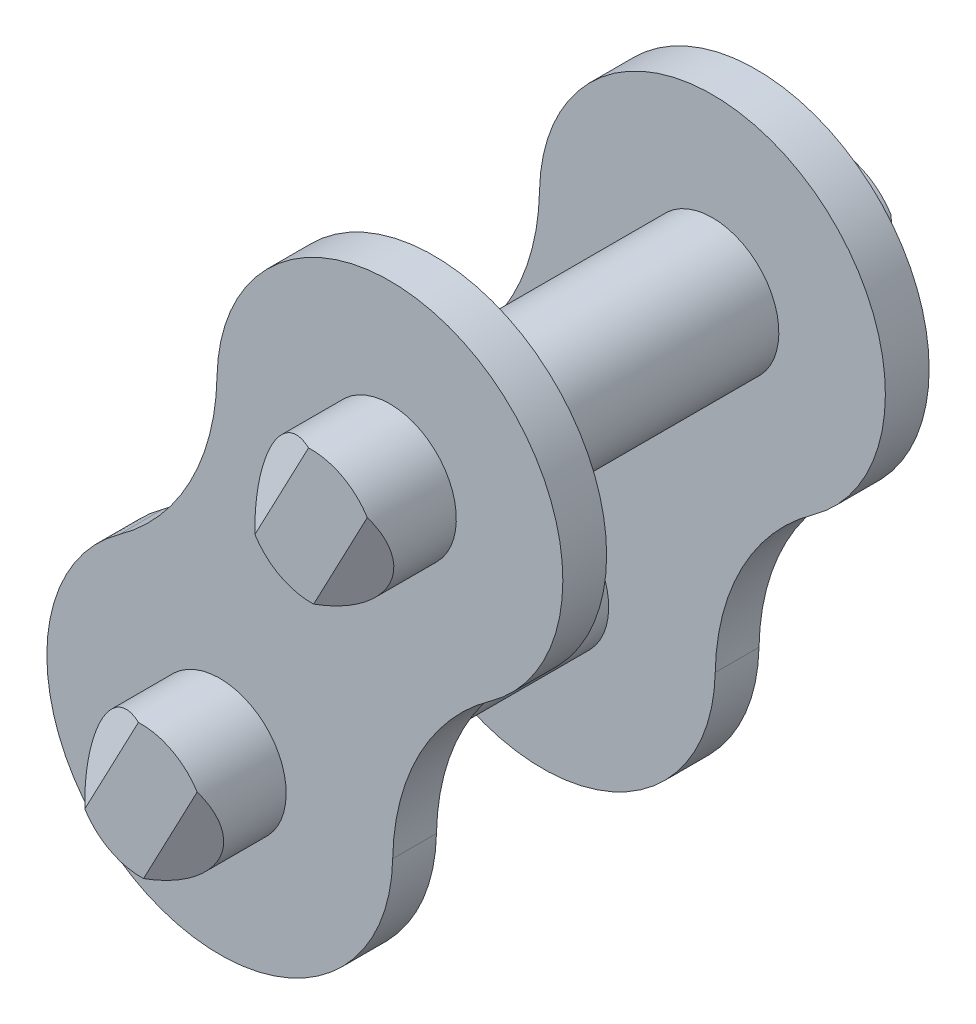
ISO-10303-21;
HEADER;
FILE_DESCRIPTION(('STEP AP214'),'2;1');
FILE_NAME('part.step','',(''),(''),'','','');
FILE_SCHEMA(('AUTOMOTIVE_DESIGN { 1 0 10303 214 1 1 1 1 }'));
ENDSEC;
DATA;
#1=APPLICATION_CONTEXT('core data for automotive mechanical design processes');
#2=APPLICATION_PROTOCOL_DEFINITION('international standard','automotive_design',2000,#1);
#3=PRODUCT_CONTEXT('',#1,'mechanical');
#4=PRODUCT('Part','Part','',(#3));
#5=PRODUCT_RELATED_PRODUCT_CATEGORY('part','',(#4));
#6=PRODUCT_DEFINITION_FORMATION('','',#4);
#7=PRODUCT_DEFINITION_CONTEXT('part definition',#1,'design');
#8=PRODUCT_DEFINITION('design','',#6,#7);
#9=PRODUCT_DEFINITION_SHAPE('','',#8);
#10=(LENGTH_UNIT() NAMED_UNIT(*) SI_UNIT(.MILLI.,.METRE.));
#11=(NAMED_UNIT(*) PLANE_ANGLE_UNIT() SI_UNIT($,.RADIAN.));
#12=(NAMED_UNIT(*) SI_UNIT($,.STERADIAN.) SOLID_ANGLE_UNIT());
#13=UNCERTAINTY_MEASURE_WITH_UNIT(LENGTH_MEASURE(1.E-05),#10,'distance_accuracy_value','');
#14=(GEOMETRIC_REPRESENTATION_CONTEXT(3) GLOBAL_UNCERTAINTY_ASSIGNED_CONTEXT((#13)) GLOBAL_UNIT_ASSIGNED_CONTEXT((#10,
#11,#12)) REPRESENTATION_CONTEXT('',''));
#15=CARTESIAN_POINT('',(0.,0.,0.));
#16=DIRECTION('',(0.,0.,1.));
#17=DIRECTION('',(1.,0.,0.));
#18=AXIS2_PLACEMENT_3D('',#15,#16,#17);
#19=CARTESIAN_POINT('',(76.8623646693601,898.104394287138,-131.392489073474));
#20=DIRECTION('',(0.442314989611032,-0.233146842066093,0.866025403784439));
#21=DIRECTION('',(-0.466293684132187,-0.884629979222066,0.));
#22=AXIS2_PLACEMENT_3D('',#19,#20,#21);
#23=PLANE('',#22);
#24=CARTESIAN_POINT('',(84.3916380449218,910.529709377054,-131.892921853051));
#25=DIRECTION('',(-0.442314989611033,0.233146842066093,-0.866025403784439));
#26=DIRECTION('',(-0.766112034955609,0.403822176082711,0.5));
#27=AXIS2_PLACEMENT_3D('',#24,#25,#26);
#28=ELLIPSE('',#27,1.3344874122049,1.1557);
#29=CARTESIAN_POINT('',(83.4137573225295,909.913761503631,-131.5593));
#30=VERTEX_POINT('',#29);
#31=CARTESIAN_POINT('',(84.3471519003271,911.684552861228,-131.5593));
#32=VERTEX_POINT('',#31);
#33=EDGE_CURVE('E210',#30,#32,#28,.T.);
#34=ORIENTED_EDGE('',*,*,#33,.T.);
#35=DIRECTION('',(0.466293684132187,0.884629979222065,0.));
#36=VECTOR('',#35,1.);
#37=CARTESIAN_POINT('',(77.1179563861069,897.96967038445,-131.5593));
#38=LINE('',#37,#36);
#39=EDGE_CURVE('E268',#30,#32,#38,.T.);
#40=ORIENTED_EDGE('',*,*,#39,.F.);
#41=EDGE_LOOP('',(#34,#40));
#42=FACE_BOUND('',#41,.T.);
#43=ADVANCED_FACE('F17',(#42),#23,.F.);
#44=CARTESIAN_POINT('',(78.3959149698406,897.29605087101,-131.392489073474));
#45=DIRECTION('',(0.442314989611033,-0.233146842066094,-0.866025403784438));
#46=DIRECTION('',(0.,-0.96561963328113,0.259959081053184));
#47=AXIS2_PLACEMENT_3D('',#44,#45,#46);
#48=PLANE('',#47);
#49=CARTESIAN_POINT('',(84.3916380449218,910.529709377054,-131.892921853051));
#50=DIRECTION('',(-0.442314989611033,0.233146842066094,0.866025403784439));
#51=DIRECTION('',(0.766112034955609,-0.403822176082711,0.5));
#52=AXIS2_PLACEMENT_3D('',#49,#50,#51);
#53=ELLIPSE('',#52,1.3344874122049,1.1557);
#54=CARTESIAN_POINT('',(84.4361241895165,909.37486589288,-131.5593));
#55=VERTEX_POINT('',#54);
#56=CARTESIAN_POINT('',(85.3695187673141,911.145657250476,-131.5593));
#57=VERTEX_POINT('',#56);
#58=EDGE_CURVE('E165',#55,#57,#53,.T.);
#59=ORIENTED_EDGE('',*,*,#58,.F.);
#60=DIRECTION('',(0.466293684132187,0.884629979222065,0.));
#61=VECTOR('',#60,1.);
#62=CARTESIAN_POINT('',(78.1403232530938,897.430774773698,-131.5593));
#63=LINE('',#62,#61);
#64=EDGE_CURVE('E269',#55,#57,#63,.T.);
#65=ORIENTED_EDGE('',*,*,#64,.T.);
#66=EDGE_LOOP('',(#59,#65));
#67=FACE_BOUND('',#66,.T.);
#68=ADVANCED_FACE('F19',(#67),#48,.T.);
#69=CARTESIAN_POINT('',(76.8623646693601,898.104394287138,-131.392489073474));
#70=DIRECTION('',(0.442314989611032,-0.233146842066093,0.866025403784439));
#71=DIRECTION('',(-0.466293684132187,-0.884629979222066,0.));
#72=AXIS2_PLACEMENT_3D('',#69,#70,#71);
#73=PLANE('',#72);
#74=CARTESIAN_POINT('',(87.3526029391612,916.147109745114,-131.892921853051));
#75=DIRECTION('',(-0.442314989611033,0.233146842066093,-0.866025403784439));
#76=DIRECTION('',(-0.766112034955609,0.403822176082711,0.5));
#77=AXIS2_PLACEMENT_3D('',#74,#75,#76);
#78=ELLIPSE('',#77,1.3344874122049,1.1557);
#79=CARTESIAN_POINT('',(86.3747222167689,915.531161871692,-131.5593));
#80=VERTEX_POINT('',#79);
#81=CARTESIAN_POINT('',(87.3081167945665,917.301953229288,-131.5593));
#82=VERTEX_POINT('',#81);
#83=EDGE_CURVE('E275',#80,#82,#78,.T.);
#84=ORIENTED_EDGE('',*,*,#83,.T.);
#85=DIRECTION('',(0.466293684132187,0.884629979222065,0.));
#86=VECTOR('',#85,1.);
#87=CARTESIAN_POINT('',(77.1179563861069,897.96967038445,-131.5593));
#88=LINE('',#87,#86);
#89=EDGE_CURVE('E238',#80,#82,#88,.T.);
#90=ORIENTED_EDGE('',*,*,#89,.F.);
#91=EDGE_LOOP('',(#84,#90));
#92=FACE_BOUND('',#91,.T.);
#93=ADVANCED_FACE('F424',(#92),#73,.F.);
#94=CARTESIAN_POINT('',(78.3959149698406,897.29605087101,-131.392489073474));
#95=DIRECTION('',(0.442314989611033,-0.233146842066094,-0.866025403784438));
#96=DIRECTION('',(0.,-0.96561963328113,0.259959081053184));
#97=AXIS2_PLACEMENT_3D('',#94,#95,#96);
#98=PLANE('',#97);
#99=CARTESIAN_POINT('',(87.3526029391612,916.147109745114,-131.892921853051));
#100=DIRECTION('',(-0.442314989611033,0.233146842066094,0.866025403784439));
#101=DIRECTION('',(0.766112034955609,-0.403822176082711,0.5));
#102=AXIS2_PLACEMENT_3D('',#99,#100,#101);
#103=ELLIPSE('',#102,1.3344874122049,1.1557);
#104=CARTESIAN_POINT('',(87.3970890837559,914.99226626094,-131.5593));
#105=VERTEX_POINT('',#104);
#106=CARTESIAN_POINT('',(88.3304836615534,916.763057618536,-131.5593));
#107=VERTEX_POINT('',#106);
#108=EDGE_CURVE('E283',#105,#107,#103,.T.);
#109=ORIENTED_EDGE('',*,*,#108,.F.);
#110=DIRECTION('',(0.466293684132187,0.884629979222065,0.));
#111=VECTOR('',#110,1.);
#112=CARTESIAN_POINT('',(78.1403232530938,897.430774773698,-131.5593));
#113=LINE('',#112,#111);
#114=EDGE_CURVE('E234',#105,#107,#113,.T.);
#115=ORIENTED_EDGE('',*,*,#114,.T.);
#116=EDGE_LOOP('',(#109,#115));
#117=FACE_BOUND('',#116,.T.);
#118=ADVANCED_FACE('F415',(#117),#98,.T.);
#119=CARTESIAN_POINT('',(85.8721204920415,913.338409561084,-129.4257));
#120=DIRECTION('',(0.,0.,-1.));
#121=DIRECTION('',(0.,-1.,0.));
#122=AXIS2_PLACEMENT_3D('',#119,#120,#121);
#123=PLANE('',#122);
#124=CARTESIAN_POINT('',(84.3916380449218,910.529709377054,-129.4257));
#125=DIRECTION('',(0.,0.,1.));
#126=DIRECTION('',(0.466293684132187,0.884629979222065,0.));
#127=AXIS2_PLACEMENT_3D('',#124,#125,#126);
#128=CIRCLE('',#127,1.1557);
#129=CARTESIAN_POINT('',(84.9305336556734,911.552076244041,-129.4257));
#130=VERTEX_POINT('',#129);
#131=EDGE_CURVE('E183',#130,#130,#128,.T.);
#132=ORIENTED_EDGE('',*,*,#131,.F.);
#133=EDGE_LOOP('',(#132));
#134=FACE_BOUND('',#133,.T.);
#135=CARTESIAN_POINT('',(87.3526029391612,916.147109745114,-129.4257));
#136=DIRECTION('',(0.,0.,1.));
#137=DIRECTION('',(0.466293684132187,0.884629979222065,0.));
#138=AXIS2_PLACEMENT_3D('',#135,#136,#137);
#139=CIRCLE('',#138,1.1557);
#140=CARTESIAN_POINT('',(87.8914985499128,917.169476612101,-129.4257));
#141=VERTEX_POINT('',#140);
#142=EDGE_CURVE('E188',#141,#141,#139,.T.);
#143=ORIENTED_EDGE('',*,*,#142,.F.);
#144=EDGE_LOOP('',(#143));
#145=FACE_BOUND('',#144,.T.);
#146=CARTESIAN_POINT('',(91.4648173346434,910.390466040942,-129.4257));
#147=DIRECTION('',(0.,0.,1.));
#148=DIRECTION('',(0.466293684132187,0.884629979222065,0.));
#149=AXIS2_PLACEMENT_3D('',#146,#147,#148);
#150=CIRCLE('',#149,4.06464973628698);
#151=CARTESIAN_POINT('',(89.1021636278755,913.697918979472,-129.4257));
#152=VERTEX_POINT('',#151);
#153=CARTESIAN_POINT('',(87.4009549820739,910.470467653837,-129.4257));
#154=VERTEX_POINT('',#153);
#155=EDGE_CURVE('E237',#152,#154,#150,.T.);
#156=ORIENTED_EDGE('',*,*,#155,.F.);
#157=CARTESIAN_POINT('',(87.3526029391612,916.147109745114,-129.4257));
#158=DIRECTION('',(0.,0.,1.));
#159=DIRECTION('',(0.466293684132187,0.884629979222065,0.));
#160=AXIS2_PLACEMENT_3D('',#157,#158,#159);
#161=CIRCLE('',#160,3.0099);
#162=CARTESIAN_POINT('',(84.3432860020091,916.206351468331,-129.4257));
#163=VERTEX_POINT('',#162);
#164=EDGE_CURVE('E131',#152,#163,#161,.T.);
#165=ORIENTED_EDGE('',*,*,#164,.T.);
#166=CARTESIAN_POINT('',(80.2794236494397,916.286353081226,-129.4257));
#167=DIRECTION('',(0.,0.,1.));
#168=DIRECTION('',(0.466293684132187,0.884629979222065,0.));
#169=AXIS2_PLACEMENT_3D('',#166,#167,#168);
#170=CIRCLE('',#169,4.06464973628691);
#171=CARTESIAN_POINT('',(82.6420773562075,912.978900142696,-129.4257));
#172=VERTEX_POINT('',#171);
#173=EDGE_CURVE('E116',#172,#163,#170,.T.);
#174=ORIENTED_EDGE('',*,*,#173,.F.);
#175=CARTESIAN_POINT('',(84.3916380449218,910.529709377054,-129.4257));
#176=DIRECTION('',(0.,0.,1.));
#177=DIRECTION('',(0.466293684132187,0.884629979222065,0.));
#178=AXIS2_PLACEMENT_3D('',#175,#176,#177);
#179=CIRCLE('',#178,3.0099);
#180=EDGE_CURVE('E21',#172,#154,#179,.T.);
#181=ORIENTED_EDGE('',*,*,#180,.T.);
#182=EDGE_LOOP('',(#156,#165,#174,#181));
#183=FACE_BOUND('',#182,.T.);
#184=ADVANCED_FACE('F309',(#134,#145,#183),#123,.F.);
#185=CARTESIAN_POINT('',(85.8721204920415,913.338409561084,-130.1877));
#186=DIRECTION('',(0.,0.,-1.));
#187=DIRECTION('',(0.,-1.,0.));
#188=AXIS2_PLACEMENT_3D('',#185,#186,#187);
#189=PLANE('',#188);
#190=CARTESIAN_POINT('',(84.3916380449218,910.529709377054,-130.1877));
#191=DIRECTION('',(0.,0.,1.));
#192=DIRECTION('',(0.466293684132187,0.884629979222065,0.));
#193=AXIS2_PLACEMENT_3D('',#190,#191,#192);
#194=CIRCLE('',#193,1.1557);
#195=CARTESIAN_POINT('',(84.9305336556734,911.552076244041,-130.1877));
#196=VERTEX_POINT('',#195);
#197=EDGE_CURVE('E187',#196,#196,#194,.T.);
#198=ORIENTED_EDGE('',*,*,#197,.T.);
#199=EDGE_LOOP('',(#198));
#200=FACE_BOUND('',#199,.T.);
#201=CARTESIAN_POINT('',(87.3526029391612,916.147109745114,-130.1877));
#202=DIRECTION('',(0.,0.,1.));
#203=DIRECTION('',(0.466293684132187,0.884629979222065,0.));
#204=AXIS2_PLACEMENT_3D('',#201,#202,#203);
#205=CIRCLE('',#204,1.1557);
#206=CARTESIAN_POINT('',(87.8914985499128,917.169476612101,-130.1877));
#207=VERTEX_POINT('',#206);
#208=EDGE_CURVE('E272',#207,#207,#205,.T.);
#209=ORIENTED_EDGE('',*,*,#208,.T.);
#210=EDGE_LOOP('',(#209));
#211=FACE_BOUND('',#210,.T.);
#212=CARTESIAN_POINT('',(91.4648173346434,910.390466040942,-130.1877));
#213=DIRECTION('',(0.,0.,1.));
#214=DIRECTION('',(0.466293684132187,0.884629979222065,0.));
#215=AXIS2_PLACEMENT_3D('',#212,#213,#214);
#216=CIRCLE('',#215,4.06464973628698);
#217=CARTESIAN_POINT('',(89.1021636278755,913.697918979472,-130.1877));
#218=VERTEX_POINT('',#217);
#219=CARTESIAN_POINT('',(87.4009549820739,910.470467653837,-130.1877));
#220=VERTEX_POINT('',#219);
#221=EDGE_CURVE('E259',#218,#220,#216,.T.);
#222=ORIENTED_EDGE('',*,*,#221,.T.);
#223=CARTESIAN_POINT('',(84.3916380449218,910.529709377054,-130.1877));
#224=DIRECTION('',(0.,0.,1.));
#225=DIRECTION('',(0.466293684132187,0.884629979222065,0.));
#226=AXIS2_PLACEMENT_3D('',#223,#224,#225);
#227=CIRCLE('',#226,3.0099);
#228=CARTESIAN_POINT('',(82.6420773562075,912.978900142696,-130.1877));
#229=VERTEX_POINT('',#228);
#230=EDGE_CURVE('E11',#229,#220,#227,.T.);
#231=ORIENTED_EDGE('',*,*,#230,.F.);
#232=CARTESIAN_POINT('',(80.2794236494397,916.286353081226,-130.1877));
#233=DIRECTION('',(0.,0.,1.));
#234=DIRECTION('',(0.466293684132187,0.884629979222065,0.));
#235=AXIS2_PLACEMENT_3D('',#232,#233,#234);
#236=CIRCLE('',#235,4.06464973628691);
#237=CARTESIAN_POINT('',(84.3432860020091,916.206351468331,-130.1877));
#238=VERTEX_POINT('',#237);
#239=EDGE_CURVE('E106',#229,#238,#236,.T.);
#240=ORIENTED_EDGE('',*,*,#239,.T.);
#241=CARTESIAN_POINT('',(87.3526029391612,916.147109745114,-130.1877));
#242=DIRECTION('',(0.,0.,1.));
#243=DIRECTION('',(0.466293684132187,0.884629979222065,0.));
#244=AXIS2_PLACEMENT_3D('',#241,#242,#243);
#245=CIRCLE('',#244,3.0099);
#246=EDGE_CURVE('E110',#218,#238,#245,.T.);
#247=ORIENTED_EDGE('',*,*,#246,.F.);
#248=EDGE_LOOP('',(#222,#231,#240,#247));
#249=FACE_BOUND('',#248,.T.);
#250=ADVANCED_FACE('F108',(#200,#211,#249),#189,.T.);
#251=CARTESIAN_POINT('',(84.3916380449218,910.529709377054,-130.1877));
#252=DIRECTION('',(0.,0.,1.));
#253=DIRECTION('',(-0.466293684132187,-0.884629979222065,0.));
#254=AXIS2_PLACEMENT_3D('',#251,#252,#253);
#255=CYLINDRICAL_SURFACE('',#254,3.0099);
#256=ORIENTED_EDGE('',*,*,#180,.F.);
#257=DIRECTION('',(0.,0.,1.));
#258=VECTOR('',#257,1.);
#259=CARTESIAN_POINT('',(82.6420773562075,912.978900142696,-130.1877));
#260=LINE('',#259,#258);
#261=EDGE_CURVE('E115',#229,#172,#260,.T.);
#262=ORIENTED_EDGE('',*,*,#261,.F.);
#263=ORIENTED_EDGE('',*,*,#230,.T.);
#264=DIRECTION('',(0.,0.,1.));
#265=VECTOR('',#264,1.);
#266=CARTESIAN_POINT('',(87.4009549820739,910.470467653837,-130.1877));
#267=LINE('',#266,#265);
#268=EDGE_CURVE('E296',#220,#154,#267,.T.);
#269=ORIENTED_EDGE('',*,*,#268,.T.);
#270=EDGE_LOOP('',(#256,#262,#263,#269));
#271=FACE_BOUND('',#270,.T.);
#272=ADVANCED_FACE('F312',(#271),#255,.T.);
#273=CARTESIAN_POINT('',(80.2794236494397,916.286353081226,-130.1877));
#274=DIRECTION('',(0.,0.,1.));
#275=DIRECTION('',(-0.466293684132187,-0.884629979222065,0.));
#276=AXIS2_PLACEMENT_3D('',#273,#274,#275);
#277=CYLINDRICAL_SURFACE('',#276,4.06464973628691);
#278=ORIENTED_EDGE('',*,*,#173,.T.);
#279=DIRECTION('',(0.,0.,1.));
#280=VECTOR('',#279,1.);
#281=CARTESIAN_POINT('',(84.3432860020091,916.206351468331,-130.1877));
#282=LINE('',#281,#280);
#283=EDGE_CURVE('E119',#238,#163,#282,.T.);
#284=ORIENTED_EDGE('',*,*,#283,.F.);
#285=ORIENTED_EDGE('',*,*,#239,.F.);
#286=ORIENTED_EDGE('',*,*,#261,.T.);
#287=EDGE_LOOP('',(#278,#284,#285,#286));
#288=FACE_BOUND('',#287,.T.);
#289=ADVANCED_FACE('F120',(#288),#277,.F.);
#290=CARTESIAN_POINT('',(87.3526029391612,916.147109745114,-130.1877));
#291=DIRECTION('',(0.,0.,1.));
#292=DIRECTION('',(-0.466293684132187,-0.884629979222065,0.));
#293=AXIS2_PLACEMENT_3D('',#290,#291,#292);
#294=CYLINDRICAL_SURFACE('',#293,3.0099);
#295=ORIENTED_EDGE('',*,*,#164,.F.);
#296=DIRECTION('',(0.,0.,1.));
#297=VECTOR('',#296,1.);
#298=CARTESIAN_POINT('',(89.1021636278755,913.697918979472,-130.1877));
#299=LINE('',#298,#297);
#300=EDGE_CURVE('E128',#218,#152,#299,.T.);
#301=ORIENTED_EDGE('',*,*,#300,.F.);
#302=ORIENTED_EDGE('',*,*,#246,.T.);
#303=ORIENTED_EDGE('',*,*,#283,.T.);
#304=EDGE_LOOP('',(#295,#301,#302,#303));
#305=FACE_BOUND('',#304,.T.);
#306=ADVANCED_FACE('F126',(#305),#294,.T.);
#307=CARTESIAN_POINT('',(91.4648173346434,910.390466040942,-130.1877));
#308=DIRECTION('',(0.,0.,1.));
#309=DIRECTION('',(-0.466293684132187,-0.884629979222065,0.));
#310=AXIS2_PLACEMENT_3D('',#307,#308,#309);
#311=CYLINDRICAL_SURFACE('',#310,4.06464973628698);
#312=ORIENTED_EDGE('',*,*,#155,.T.);
#313=ORIENTED_EDGE('',*,*,#268,.F.);
#314=ORIENTED_EDGE('',*,*,#221,.F.);
#315=ORIENTED_EDGE('',*,*,#300,.T.);
#316=EDGE_LOOP('',(#312,#313,#314,#315));
#317=FACE_BOUND('',#316,.T.);
#318=ADVANCED_FACE('F314',(#317),#311,.F.);
#319=CARTESIAN_POINT('',(85.8721204920415,913.338409561084,-131.5593));
#320=DIRECTION('',(0.,0.,-1.));
#321=DIRECTION('',(0.,-1.,0.));
#322=AXIS2_PLACEMENT_3D('',#319,#320,#321);
#323=PLANE('',#322);
#324=ORIENTED_EDGE('',*,*,#89,.T.);
#325=CARTESIAN_POINT('',(87.3526029391612,916.147109745114,-131.5593));
#326=DIRECTION('',(0.,0.,1.));
#327=DIRECTION('',(0.466293684132187,0.884629979222065,0.));
#328=AXIS2_PLACEMENT_3D('',#325,#326,#327);
#329=CIRCLE('',#328,1.1557);
#330=EDGE_CURVE('E287',#107,#82,#329,.T.);
#331=ORIENTED_EDGE('',*,*,#330,.F.);
#332=ORIENTED_EDGE('',*,*,#114,.F.);
#333=CARTESIAN_POINT('',(87.3526029391612,916.147109745114,-131.5593));
#334=DIRECTION('',(0.,0.,1.));
#335=DIRECTION('',(0.466293684132187,0.884629979222065,0.));
#336=AXIS2_PLACEMENT_3D('',#333,#334,#335);
#337=CIRCLE('',#336,1.1557);
#338=EDGE_CURVE('E279',#80,#105,#337,.T.);
#339=ORIENTED_EDGE('',*,*,#338,.F.);
#340=EDGE_LOOP('',(#324,#331,#332,#339));
#341=FACE_BOUND('',#340,.T.);
#342=ADVANCED_FACE('F441',(#341),#323,.T.);
#343=CARTESIAN_POINT('',(87.3526029391612,916.147109745114,-131.5593));
#344=DIRECTION('',(0.,0.,1.));
#345=DIRECTION('',(-0.466293684132187,-0.884629979222065,0.));
#346=AXIS2_PLACEMENT_3D('',#343,#344,#345);
#347=CYLINDRICAL_SURFACE('',#346,1.1557);
#348=ORIENTED_EDGE('',*,*,#83,.F.);
#349=ORIENTED_EDGE('',*,*,#338,.T.);
#350=ORIENTED_EDGE('',*,*,#108,.T.);
#351=ORIENTED_EDGE('',*,*,#330,.T.);
#352=EDGE_LOOP('',(#348,#349,#350,#351));
#353=FACE_BOUND('',#352,.T.);
#354=ORIENTED_EDGE('',*,*,#208,.F.);
#355=EDGE_LOOP('',(#354));
#356=FACE_BOUND('',#355,.T.);
#357=ADVANCED_FACE('F444',(#353,#356),#347,.T.);
#358=CARTESIAN_POINT('',(85.8721204920415,913.338409561084,-131.5593));
#359=DIRECTION('',(0.,0.,-1.));
#360=DIRECTION('',(0.,-1.,0.));
#361=AXIS2_PLACEMENT_3D('',#358,#359,#360);
#362=PLANE('',#361);
#363=ORIENTED_EDGE('',*,*,#39,.T.);
#364=CARTESIAN_POINT('',(84.3916380449218,910.529709377054,-131.5593));
#365=DIRECTION('',(0.,0.,1.));
#366=DIRECTION('',(0.466293684132187,0.884629979222065,0.));
#367=AXIS2_PLACEMENT_3D('',#364,#365,#366);
#368=CIRCLE('',#367,1.1557);
#369=EDGE_CURVE('E169',#57,#32,#368,.T.);
#370=ORIENTED_EDGE('',*,*,#369,.F.);
#371=ORIENTED_EDGE('',*,*,#64,.F.);
#372=CARTESIAN_POINT('',(84.3916380449218,910.529709377054,-131.5593));
#373=DIRECTION('',(0.,0.,1.));
#374=DIRECTION('',(0.466293684132187,0.884629979222065,0.));
#375=AXIS2_PLACEMENT_3D('',#372,#373,#374);
#376=CIRCLE('',#375,1.1557);
#377=EDGE_CURVE('E170',#30,#55,#376,.T.);
#378=ORIENTED_EDGE('',*,*,#377,.F.);
#379=EDGE_LOOP('',(#363,#370,#371,#378));
#380=FACE_BOUND('',#379,.T.);
#381=ADVANCED_FACE('F439',(#380),#362,.T.);
#382=CARTESIAN_POINT('',(84.3916380449218,910.529709377054,-131.5593));
#383=DIRECTION('',(0.,0.,1.));
#384=DIRECTION('',(-0.466293684132187,-0.884629979222065,0.));
#385=AXIS2_PLACEMENT_3D('',#382,#383,#384);
#386=CYLINDRICAL_SURFACE('',#385,1.1557);
#387=ORIENTED_EDGE('',*,*,#33,.F.);
#388=ORIENTED_EDGE('',*,*,#377,.T.);
#389=ORIENTED_EDGE('',*,*,#58,.T.);
#390=ORIENTED_EDGE('',*,*,#369,.T.);
#391=EDGE_LOOP('',(#387,#388,#389,#390));
#392=FACE_BOUND('',#391,.T.);
#393=ORIENTED_EDGE('',*,*,#197,.F.);
#394=EDGE_LOOP('',(#393));
#395=FACE_BOUND('',#394,.T.);
#396=ADVANCED_FACE('F470',(#392,#395),#386,.T.);
#397=CARTESIAN_POINT('',(76.8623646693601,898.104394287138,-122.607510926526));
#398=DIRECTION('',(0.442314989611032,-0.233146842066093,-0.866025403784439));
#399=DIRECTION('',(0.,-0.96561963328113,0.259959081053183));
#400=AXIS2_PLACEMENT_3D('',#397,#398,#399);
#401=PLANE('',#400);
#402=CARTESIAN_POINT('',(84.3916380449218,910.529709377054,-122.107078146949));
#403=DIRECTION('',(0.442314989611033,-0.233146842066093,-0.866025403784439));
#404=DIRECTION('',(-0.766112034955609,0.403822176082711,-0.5));
#405=AXIS2_PLACEMENT_3D('',#402,#403,#404);
#406=ELLIPSE('',#405,1.3344874122049,1.1557);
#407=CARTESIAN_POINT('',(83.4137573225295,909.913761503631,-122.4407));
#408=VERTEX_POINT('',#407);
#409=CARTESIAN_POINT('',(84.3471519003271,911.684552861228,-122.4407));
#410=VERTEX_POINT('',#409);
#411=EDGE_CURVE('E140',#408,#410,#406,.T.);
#412=ORIENTED_EDGE('',*,*,#411,.F.);
#413=DIRECTION('',(0.466293684132187,0.884629979222065,0.));
#414=VECTOR('',#413,1.);
#415=CARTESIAN_POINT('',(77.1179563861069,897.96967038445,-122.4407));
#416=LINE('',#415,#414);
#417=EDGE_CURVE('E164',#408,#410,#416,.T.);
#418=ORIENTED_EDGE('',*,*,#417,.T.);
#419=EDGE_LOOP('',(#412,#418));
#420=FACE_BOUND('',#419,.T.);
#421=ADVANCED_FACE('F479',(#420),#401,.F.);
#422=CARTESIAN_POINT('',(78.3959149698406,897.29605087101,-122.607510926526));
#423=DIRECTION('',(0.442314989611033,-0.233146842066094,0.866025403784438));
#424=DIRECTION('',(-0.466293684132188,-0.884629979222065,0.));
#425=AXIS2_PLACEMENT_3D('',#422,#423,#424);
#426=PLANE('',#425);
#427=CARTESIAN_POINT('',(84.3916380449218,910.529709377054,-122.107078146949));
#428=DIRECTION('',(0.442314989611033,-0.233146842066094,0.866025403784439));
#429=DIRECTION('',(0.766112034955609,-0.403822176082711,-0.5));
#430=AXIS2_PLACEMENT_3D('',#427,#428,#429);
#431=ELLIPSE('',#430,1.3344874122049,1.1557);
#432=CARTESIAN_POINT('',(84.4361241895165,909.37486589288,-122.4407));
#433=VERTEX_POINT('',#432);
#434=CARTESIAN_POINT('',(85.3695187673141,911.145657250476,-122.4407));
#435=VERTEX_POINT('',#434);
#436=EDGE_CURVE('E151',#433,#435,#431,.T.);
#437=ORIENTED_EDGE('',*,*,#436,.T.);
#438=DIRECTION('',(0.466293684132187,0.884629979222065,0.));
#439=VECTOR('',#438,1.);
#440=CARTESIAN_POINT('',(78.1403232530938,897.430774773698,-122.4407));
#441=LINE('',#440,#439);
#442=EDGE_CURVE('E179',#433,#435,#441,.T.);
#443=ORIENTED_EDGE('',*,*,#442,.F.);
#444=EDGE_LOOP('',(#437,#443));
#445=FACE_BOUND('',#444,.T.);
#446=ADVANCED_FACE('F482',(#445),#426,.T.);
#447=CARTESIAN_POINT('',(76.8623646693601,898.104394287138,-122.607510926526));
#448=DIRECTION('',(0.442314989611032,-0.233146842066093,-0.866025403784439));
#449=DIRECTION('',(0.,-0.96561963328113,0.259959081053183));
#450=AXIS2_PLACEMENT_3D('',#447,#448,#449);
#451=PLANE('',#450);
#452=CARTESIAN_POINT('',(87.3526029391612,916.147109745114,-122.107078146949));
#453=DIRECTION('',(0.442314989611033,-0.233146842066093,-0.866025403784439));
#454=DIRECTION('',(-0.766112034955609,0.403822176082711,-0.5));
#455=AXIS2_PLACEMENT_3D('',#452,#453,#454);
#456=ELLIPSE('',#455,1.3344874122049,1.1557);
#457=CARTESIAN_POINT('',(86.3747222167689,915.531161871692,-122.4407));
#458=VERTEX_POINT('',#457);
#459=CARTESIAN_POINT('',(87.3081167945665,917.301953229288,-122.4407));
#460=VERTEX_POINT('',#459);
#461=EDGE_CURVE('E175',#458,#460,#456,.T.);
#462=ORIENTED_EDGE('',*,*,#461,.F.);
#463=DIRECTION('',(0.466293684132187,0.884629979222065,0.));
#464=VECTOR('',#463,1.);
#465=CARTESIAN_POINT('',(77.1179563861069,897.96967038445,-122.4407));
#466=LINE('',#465,#464);
#467=EDGE_CURVE('E145',#458,#460,#466,.T.);
#468=ORIENTED_EDGE('',*,*,#467,.T.);
#469=EDGE_LOOP('',(#462,#468));
#470=FACE_BOUND('',#469,.T.);
#471=ADVANCED_FACE('F559',(#470),#451,.F.);
#472=CARTESIAN_POINT('',(78.3959149698406,897.29605087101,-122.607510926526));
#473=DIRECTION('',(0.442314989611033,-0.233146842066094,0.866025403784438));
#474=DIRECTION('',(-0.466293684132188,-0.884629979222065,0.));
#475=AXIS2_PLACEMENT_3D('',#472,#473,#474);
#476=PLANE('',#475);
#477=CARTESIAN_POINT('',(87.3526029391612,916.147109745114,-122.107078146949));
#478=DIRECTION('',(0.442314989611033,-0.233146842066094,0.866025403784439));
#479=DIRECTION('',(0.766112034955609,-0.403822176082711,-0.5));
#480=AXIS2_PLACEMENT_3D('',#477,#478,#479);
#481=ELLIPSE('',#480,1.3344874122049,1.1557);
#482=CARTESIAN_POINT('',(87.3970890837559,914.99226626094,-122.4407));
#483=VERTEX_POINT('',#482);
#484=CARTESIAN_POINT('',(88.3304836615534,916.763057618536,-122.4407));
#485=VERTEX_POINT('',#484);
#486=EDGE_CURVE('E146',#483,#485,#481,.T.);
#487=ORIENTED_EDGE('',*,*,#486,.T.);
#488=DIRECTION('',(0.466293684132187,0.884629979222065,0.));
#489=VECTOR('',#488,1.);
#490=CARTESIAN_POINT('',(78.1403232530938,897.430774773698,-122.4407));
#491=LINE('',#490,#489);
#492=EDGE_CURVE('E152',#483,#485,#491,.T.);
#493=ORIENTED_EDGE('',*,*,#492,.F.);
#494=EDGE_LOOP('',(#487,#493));
#495=FACE_BOUND('',#494,.T.);
#496=ADVANCED_FACE('F498',(#495),#476,.T.);
#497=CARTESIAN_POINT('',(84.3916380449218,910.529709377054,-122.4407));
#498=DIRECTION('',(0.,0.,-1.));
#499=DIRECTION('',(-0.466293684132187,-0.884629979222065,0.));
#500=AXIS2_PLACEMENT_3D('',#497,#498,#499);
#501=CYLINDRICAL_SURFACE('',#500,1.1557);
#502=ORIENTED_EDGE('',*,*,#131,.T.);
#503=EDGE_LOOP('',(#502));
#504=FACE_BOUND('',#503,.T.);
#505=CARTESIAN_POINT('',(84.3916380449218,910.529709377054,-124.5743));
#506=DIRECTION('',(0.,0.,1.));
#507=DIRECTION('',(0.466293684132187,0.884629979222065,0.));
#508=AXIS2_PLACEMENT_3D('',#505,#506,#507);
#509=CIRCLE('',#508,1.1557);
#510=CARTESIAN_POINT('',(84.9305336556734,911.552076244041,-124.5743));
#511=VERTEX_POINT('',#510);
#512=EDGE_CURVE('E250',#511,#511,#509,.T.);
#513=ORIENTED_EDGE('',*,*,#512,.F.);
#514=EDGE_LOOP('',(#513));
#515=FACE_BOUND('',#514,.T.);
#516=ADVANCED_FACE('F410',(#504,#515),#501,.T.);
#517=CARTESIAN_POINT('',(87.3526029391612,916.147109745114,-122.4407));
#518=DIRECTION('',(0.,0.,-1.));
#519=DIRECTION('',(-0.466293684132187,-0.884629979222065,0.));
#520=AXIS2_PLACEMENT_3D('',#517,#518,#519);
#521=CYLINDRICAL_SURFACE('',#520,1.1557);
#522=ORIENTED_EDGE('',*,*,#142,.T.);
#523=EDGE_LOOP('',(#522));
#524=FACE_BOUND('',#523,.T.);
#525=CARTESIAN_POINT('',(87.3526029391612,916.147109745114,-124.5743));
#526=DIRECTION('',(0.,0.,1.));
#527=DIRECTION('',(0.466293684132187,0.884629979222065,0.));
#528=AXIS2_PLACEMENT_3D('',#525,#526,#527);
#529=CIRCLE('',#528,1.1557);
#530=CARTESIAN_POINT('',(87.8914985499128,917.169476612101,-124.5743));
#531=VERTEX_POINT('',#530);
#532=EDGE_CURVE('E246',#531,#531,#529,.T.);
#533=ORIENTED_EDGE('',*,*,#532,.F.);
#534=EDGE_LOOP('',(#533));
#535=FACE_BOUND('',#534,.T.);
#536=ADVANCED_FACE('F491',(#524,#535),#521,.T.);
#537=CARTESIAN_POINT('',(85.8721204920415,913.338409561084,-124.5743));
#538=DIRECTION('',(0.,0.,1.));
#539=DIRECTION('',(1.,0.,0.));
#540=AXIS2_PLACEMENT_3D('',#537,#538,#539);
#541=PLANE('',#540);
#542=ORIENTED_EDGE('',*,*,#512,.T.);
#543=EDGE_LOOP('',(#542));
#544=FACE_BOUND('',#543,.T.);
#545=ORIENTED_EDGE('',*,*,#532,.T.);
#546=EDGE_LOOP('',(#545));
#547=FACE_BOUND('',#546,.T.);
#548=CARTESIAN_POINT('',(91.4648173346434,910.390466040942,-124.5743));
#549=DIRECTION('',(0.,0.,1.));
#550=DIRECTION('',(0.466293684132187,0.884629979222065,0.));
#551=AXIS2_PLACEMENT_3D('',#548,#549,#550);
#552=CIRCLE('',#551,4.06464973628698);
#553=CARTESIAN_POINT('',(89.1021636278755,913.697918979472,-124.5743));
#554=VERTEX_POINT('',#553);
#555=CARTESIAN_POINT('',(87.4009549820739,910.470467653837,-124.5743));
#556=VERTEX_POINT('',#555);
#557=EDGE_CURVE('E156',#554,#556,#552,.T.);
#558=ORIENTED_EDGE('',*,*,#557,.T.);
#559=CARTESIAN_POINT('',(84.3916380449218,910.529709377054,-124.5743));
#560=DIRECTION('',(0.,0.,1.));
#561=DIRECTION('',(0.466293684132187,0.884629979222065,0.));
#562=AXIS2_PLACEMENT_3D('',#559,#560,#561);
#563=CIRCLE('',#562,3.0099);
#564=CARTESIAN_POINT('',(82.6420773562075,912.978900142696,-124.5743));
#565=VERTEX_POINT('',#564);
#566=EDGE_CURVE('E233',#565,#556,#563,.T.);
#567=ORIENTED_EDGE('',*,*,#566,.F.);
#568=CARTESIAN_POINT('',(80.2794236494397,916.286353081226,-124.5743));
#569=DIRECTION('',(0.,0.,1.));
#570=DIRECTION('',(0.466293684132187,0.884629979222065,0.));
#571=AXIS2_PLACEMENT_3D('',#568,#569,#570);
#572=CIRCLE('',#571,4.06464973628691);
#573=CARTESIAN_POINT('',(84.3432860020091,916.206351468331,-124.5743));
#574=VERTEX_POINT('',#573);
#575=EDGE_CURVE('E221',#565,#574,#572,.T.);
#576=ORIENTED_EDGE('',*,*,#575,.T.);
#577=CARTESIAN_POINT('',(87.3526029391612,916.147109745114,-124.5743));
#578=DIRECTION('',(0.,0.,1.));
#579=DIRECTION('',(0.466293684132187,0.884629979222065,0.));
#580=AXIS2_PLACEMENT_3D('',#577,#578,#579);
#581=CIRCLE('',#580,3.0099);
#582=EDGE_CURVE('E193',#554,#574,#581,.T.);
#583=ORIENTED_EDGE('',*,*,#582,.F.);
#584=EDGE_LOOP('',(#558,#567,#576,#583));
#585=FACE_BOUND('',#584,.T.);
#586=ADVANCED_FACE('F349',(#544,#547,#585),#541,.F.);
#587=CARTESIAN_POINT('',(85.8721204920415,913.338409561084,-123.8123));
#588=DIRECTION('',(0.,0.,1.));
#589=DIRECTION('',(1.,0.,0.));
#590=AXIS2_PLACEMENT_3D('',#587,#588,#589);
#591=PLANE('',#590);
#592=CARTESIAN_POINT('',(84.3916380449218,910.529709377054,-123.8123));
#593=DIRECTION('',(0.,0.,1.));
#594=DIRECTION('',(0.466293684132187,0.884629979222065,0.));
#595=AXIS2_PLACEMENT_3D('',#592,#593,#594);
#596=CIRCLE('',#595,1.1557);
#597=CARTESIAN_POINT('',(84.9305336556734,911.552076244041,-123.8123));
#598=VERTEX_POINT('',#597);
#599=EDGE_CURVE('E327',#598,#598,#596,.T.);
#600=ORIENTED_EDGE('',*,*,#599,.F.);
#601=EDGE_LOOP('',(#600));
#602=FACE_BOUND('',#601,.T.);
#603=CARTESIAN_POINT('',(87.3526029391612,916.147109745114,-123.8123));
#604=DIRECTION('',(0.,0.,1.));
#605=DIRECTION('',(0.466293684132187,0.884629979222065,0.));
#606=AXIS2_PLACEMENT_3D('',#603,#604,#605);
#607=CIRCLE('',#606,1.1557);
#608=CARTESIAN_POINT('',(87.8914985499128,917.169476612101,-123.8123));
#609=VERTEX_POINT('',#608);
#610=EDGE_CURVE('E192',#609,#609,#607,.T.);
#611=ORIENTED_EDGE('',*,*,#610,.F.);
#612=EDGE_LOOP('',(#611));
#613=FACE_BOUND('',#612,.T.);
#614=CARTESIAN_POINT('',(91.4648173346434,910.390466040942,-123.8123));
#615=DIRECTION('',(0.,0.,1.));
#616=DIRECTION('',(0.466293684132187,0.884629979222065,0.));
#617=AXIS2_PLACEMENT_3D('',#614,#615,#616);
#618=CIRCLE('',#617,4.06464973628698);
#619=CARTESIAN_POINT('',(89.1021636278755,913.697918979472,-123.8123));
#620=VERTEX_POINT('',#619);
#621=CARTESIAN_POINT('',(87.4009549820739,910.470467653837,-123.8123));
#622=VERTEX_POINT('',#621);
#623=EDGE_CURVE('E203',#620,#622,#618,.T.);
#624=ORIENTED_EDGE('',*,*,#623,.F.);
#625=CARTESIAN_POINT('',(87.3526029391612,916.147109745114,-123.8123));
#626=DIRECTION('',(0.,0.,1.));
#627=DIRECTION('',(0.466293684132187,0.884629979222065,0.));
#628=AXIS2_PLACEMENT_3D('',#625,#626,#627);
#629=CIRCLE('',#628,3.0099);
#630=CARTESIAN_POINT('',(84.3432860020091,916.206351468331,-123.8123));
#631=VERTEX_POINT('',#630);
#632=EDGE_CURVE('E217',#620,#631,#629,.T.);
#633=ORIENTED_EDGE('',*,*,#632,.T.);
#634=CARTESIAN_POINT('',(80.2794236494397,916.286353081226,-123.8123));
#635=DIRECTION('',(0.,0.,1.));
#636=DIRECTION('',(0.466293684132187,0.884629979222065,0.));
#637=AXIS2_PLACEMENT_3D('',#634,#635,#636);
#638=CIRCLE('',#637,4.06464973628691);
#639=CARTESIAN_POINT('',(82.6420773562075,912.978900142696,-123.8123));
#640=VERTEX_POINT('',#639);
#641=EDGE_CURVE('E229',#640,#631,#638,.T.);
#642=ORIENTED_EDGE('',*,*,#641,.F.);
#643=CARTESIAN_POINT('',(84.3916380449218,910.529709377054,-123.8123));
#644=DIRECTION('',(0.,0.,1.));
#645=DIRECTION('',(0.466293684132187,0.884629979222065,0.));
#646=AXIS2_PLACEMENT_3D('',#643,#644,#645);
#647=CIRCLE('',#646,3.0099);
#648=EDGE_CURVE('E242',#640,#622,#647,.T.);
#649=ORIENTED_EDGE('',*,*,#648,.T.);
#650=EDGE_LOOP('',(#624,#633,#642,#649));
#651=FACE_BOUND('',#650,.T.);
#652=ADVANCED_FACE('F345',(#602,#613,#651),#591,.T.);
#653=CARTESIAN_POINT('',(84.3916380449218,910.529709377054,-123.8123));
#654=DIRECTION('',(0.,0.,-1.));
#655=DIRECTION('',(-0.466293684132187,-0.884629979222065,0.));
#656=AXIS2_PLACEMENT_3D('',#653,#654,#655);
#657=CYLINDRICAL_SURFACE('',#656,3.0099);
#658=ORIENTED_EDGE('',*,*,#566,.T.);
#659=DIRECTION('',(0.,0.,-1.));
#660=VECTOR('',#659,1.);
#661=CARTESIAN_POINT('',(87.4009549820739,910.470467653837,-123.8123));
#662=LINE('',#661,#660);
#663=EDGE_CURVE('E198',#622,#556,#662,.T.);
#664=ORIENTED_EDGE('',*,*,#663,.F.);
#665=ORIENTED_EDGE('',*,*,#648,.F.);
#666=DIRECTION('',(0.,0.,-1.));
#667=VECTOR('',#666,1.);
#668=CARTESIAN_POINT('',(82.6420773562075,912.978900142696,-123.8123));
#669=LINE('',#668,#667);
#670=EDGE_CURVE('E225',#640,#565,#669,.T.);
#671=ORIENTED_EDGE('',*,*,#670,.T.);
#672=EDGE_LOOP('',(#658,#664,#665,#671));
#673=FACE_BOUND('',#672,.T.);
#674=ADVANCED_FACE('F348',(#673),#657,.T.);
#675=CARTESIAN_POINT('',(80.2794236494397,916.286353081226,-123.8123));
#676=DIRECTION('',(0.,0.,-1.));
#677=DIRECTION('',(-0.466293684132187,-0.884629979222065,0.));
#678=AXIS2_PLACEMENT_3D('',#675,#676,#677);
#679=CYLINDRICAL_SURFACE('',#678,4.06464973628691);
#680=ORIENTED_EDGE('',*,*,#575,.F.);
#681=ORIENTED_EDGE('',*,*,#670,.F.);
#682=ORIENTED_EDGE('',*,*,#641,.T.);
#683=DIRECTION('',(0.,0.,-1.));
#684=VECTOR('',#683,1.);
#685=CARTESIAN_POINT('',(84.3432860020091,916.206351468331,-123.8123));
#686=LINE('',#685,#684);
#687=EDGE_CURVE('E197',#631,#574,#686,.T.);
#688=ORIENTED_EDGE('',*,*,#687,.T.);
#689=EDGE_LOOP('',(#680,#681,#682,#688));
#690=FACE_BOUND('',#689,.T.);
#691=ADVANCED_FACE('F478',(#690),#679,.F.);
#692=CARTESIAN_POINT('',(87.3526029391612,916.147109745114,-123.8123));
#693=DIRECTION('',(0.,0.,-1.));
#694=DIRECTION('',(-0.466293684132187,-0.884629979222065,0.));
#695=AXIS2_PLACEMENT_3D('',#692,#693,#694);
#696=CYLINDRICAL_SURFACE('',#695,3.0099);
#697=ORIENTED_EDGE('',*,*,#582,.T.);
#698=ORIENTED_EDGE('',*,*,#687,.F.);
#699=ORIENTED_EDGE('',*,*,#632,.F.);
#700=DIRECTION('',(0.,0.,-1.));
#701=VECTOR('',#700,1.);
#702=CARTESIAN_POINT('',(89.1021636278755,913.697918979472,-123.8123));
#703=LINE('',#702,#701);
#704=EDGE_CURVE('E202',#620,#554,#703,.T.);
#705=ORIENTED_EDGE('',*,*,#704,.T.);
#706=EDGE_LOOP('',(#697,#698,#699,#705));
#707=FACE_BOUND('',#706,.T.);
#708=ADVANCED_FACE('F370',(#707),#696,.T.);
#709=CARTESIAN_POINT('',(91.4648173346434,910.390466040942,-123.8123));
#710=DIRECTION('',(0.,0.,-1.));
#711=DIRECTION('',(-0.466293684132187,-0.884629979222065,0.));
#712=AXIS2_PLACEMENT_3D('',#709,#710,#711);
#713=CYLINDRICAL_SURFACE('',#712,4.06464973628698);
#714=ORIENTED_EDGE('',*,*,#557,.F.);
#715=ORIENTED_EDGE('',*,*,#704,.F.);
#716=ORIENTED_EDGE('',*,*,#623,.T.);
#717=ORIENTED_EDGE('',*,*,#663,.T.);
#718=EDGE_LOOP('',(#714,#715,#716,#717));
#719=FACE_BOUND('',#718,.T.);
#720=ADVANCED_FACE('F367',(#719),#713,.F.);
#721=CARTESIAN_POINT('',(85.8721204920415,913.338409561084,-122.4407));
#722=DIRECTION('',(0.,0.,1.));
#723=DIRECTION('',(1.,0.,0.));
#724=AXIS2_PLACEMENT_3D('',#721,#722,#723);
#725=PLANE('',#724);
#726=ORIENTED_EDGE('',*,*,#467,.F.);
#727=CARTESIAN_POINT('',(87.3526029391612,916.147109745114,-122.4407));
#728=DIRECTION('',(0.,0.,1.));
#729=DIRECTION('',(0.466293684132187,0.884629979222065,0.));
#730=AXIS2_PLACEMENT_3D('',#727,#728,#729);
#731=CIRCLE('',#730,1.1557);
#732=EDGE_CURVE('E142',#458,#483,#731,.T.);
#733=ORIENTED_EDGE('',*,*,#732,.T.);
#734=ORIENTED_EDGE('',*,*,#492,.T.);
#735=CARTESIAN_POINT('',(87.3526029391612,916.147109745114,-122.4407));
#736=DIRECTION('',(0.,0.,1.));
#737=DIRECTION('',(0.466293684132187,0.884629979222065,0.));
#738=AXIS2_PLACEMENT_3D('',#735,#736,#737);
#739=CIRCLE('',#738,1.1557);
#740=EDGE_CURVE('E171',#485,#460,#739,.T.);
#741=ORIENTED_EDGE('',*,*,#740,.T.);
#742=EDGE_LOOP('',(#726,#733,#734,#741));
#743=FACE_BOUND('',#742,.T.);
#744=ADVANCED_FACE('F474',(#743),#725,.T.);
#745=CARTESIAN_POINT('',(87.3526029391612,916.147109745114,-122.4407));
#746=DIRECTION('',(0.,0.,-1.));
#747=DIRECTION('',(-0.466293684132187,-0.884629979222065,0.));
#748=AXIS2_PLACEMENT_3D('',#745,#746,#747);
#749=CYLINDRICAL_SURFACE('',#748,1.1557);
#750=ORIENTED_EDGE('',*,*,#461,.T.);
#751=ORIENTED_EDGE('',*,*,#740,.F.);
#752=ORIENTED_EDGE('',*,*,#486,.F.);
#753=ORIENTED_EDGE('',*,*,#732,.F.);
#754=EDGE_LOOP('',(#750,#751,#752,#753));
#755=FACE_BOUND('',#754,.T.);
#756=ORIENTED_EDGE('',*,*,#610,.T.);
#757=EDGE_LOOP('',(#756));
#758=FACE_BOUND('',#757,.T.);
#759=ADVANCED_FACE('F339',(#755,#758),#749,.T.);
#760=CARTESIAN_POINT('',(85.8721204920415,913.338409561084,-122.4407));
#761=DIRECTION('',(0.,0.,1.));
#762=DIRECTION('',(1.,0.,0.));
#763=AXIS2_PLACEMENT_3D('',#760,#761,#762);
#764=PLANE('',#763);
#765=ORIENTED_EDGE('',*,*,#417,.F.);
#766=CARTESIAN_POINT('',(84.3916380449218,910.529709377054,-122.4407));
#767=DIRECTION('',(0.,0.,1.));
#768=DIRECTION('',(0.466293684132187,0.884629979222065,0.));
#769=AXIS2_PLACEMENT_3D('',#766,#767,#768);
#770=CIRCLE('',#769,1.1557);
#771=EDGE_CURVE('E160',#408,#433,#770,.T.);
#772=ORIENTED_EDGE('',*,*,#771,.T.);
#773=ORIENTED_EDGE('',*,*,#442,.T.);
#774=CARTESIAN_POINT('',(84.3916380449218,910.529709377054,-122.4407));
#775=DIRECTION('',(0.,0.,1.));
#776=DIRECTION('',(0.466293684132187,0.884629979222065,0.));
#777=AXIS2_PLACEMENT_3D('',#774,#775,#776);
#778=CIRCLE('',#777,1.1557);
#779=EDGE_CURVE('E147',#435,#410,#778,.T.);
#780=ORIENTED_EDGE('',*,*,#779,.T.);
#781=EDGE_LOOP('',(#765,#772,#773,#780));
#782=FACE_BOUND('',#781,.T.);
#783=ADVANCED_FACE('F538',(#782),#764,.T.);
#784=CARTESIAN_POINT('',(84.3916380449218,910.529709377054,-122.4407));
#785=DIRECTION('',(0.,0.,-1.));
#786=DIRECTION('',(-0.466293684132187,-0.884629979222065,0.));
#787=AXIS2_PLACEMENT_3D('',#784,#785,#786);
#788=CYLINDRICAL_SURFACE('',#787,1.1557);
#789=ORIENTED_EDGE('',*,*,#411,.T.);
#790=ORIENTED_EDGE('',*,*,#779,.F.);
#791=ORIENTED_EDGE('',*,*,#436,.F.);
#792=ORIENTED_EDGE('',*,*,#771,.F.);
#793=EDGE_LOOP('',(#789,#790,#791,#792));
#794=FACE_BOUND('',#793,.T.);
#795=ORIENTED_EDGE('',*,*,#599,.T.);
#796=EDGE_LOOP('',(#795));
#797=FACE_BOUND('',#796,.T.);
#798=ADVANCED_FACE('F542',(#794,#797),#788,.T.);
#799=CLOSED_SHELL('',(#43,#68,#93,#118,#184,#250,#272,#289,#306,#318,#342,#357,#381,#396,#421,
#446,#471,#496,#516,#536,#586,#652,#674,#691,#708,#720,#744,#759,#783,#798));
#800=MANIFOLD_SOLID_BREP('B1',#799);
#801=ADVANCED_BREP_SHAPE_REPRESENTATION('',(#18,#800),#14);
#802=SHAPE_DEFINITION_REPRESENTATION(#9,#801);
ENDSEC;
END-ISO-10303-21;
